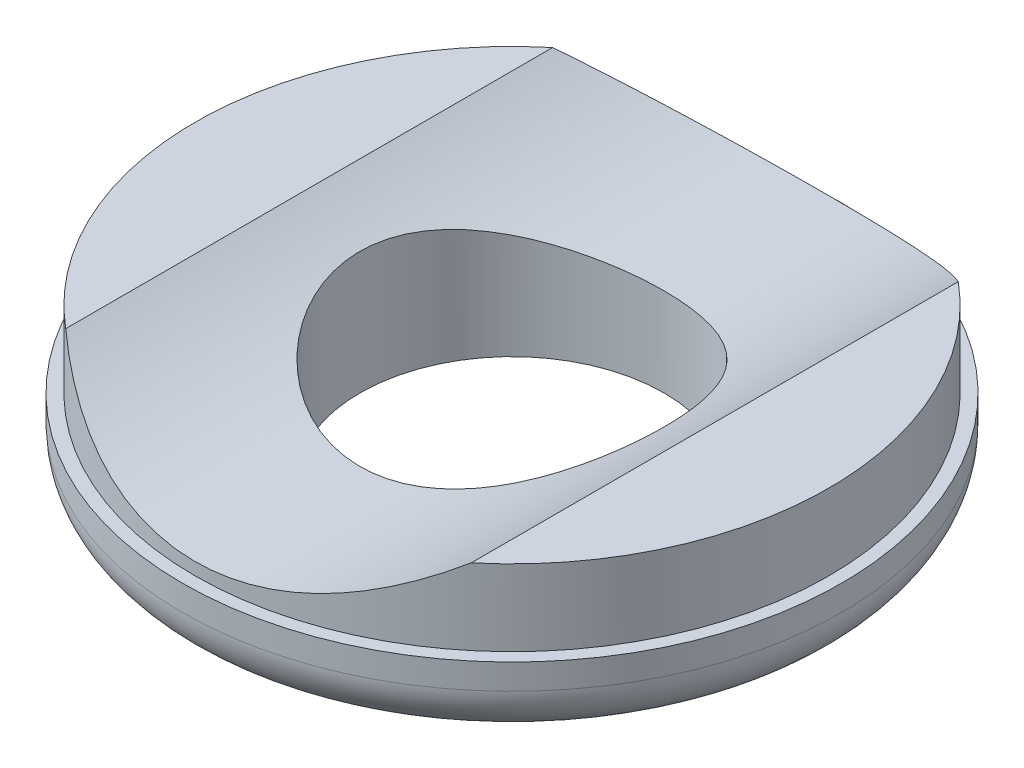
ISO-10303-21;
HEADER;
FILE_DESCRIPTION(('STEP AP214'),'2;1');
FILE_NAME('part.step','',(''),(''),'','','');
FILE_SCHEMA(('AUTOMOTIVE_DESIGN { 1 0 10303 214 1 1 1 1 }'));
ENDSEC;
DATA;
#1=APPLICATION_CONTEXT('core data for automotive mechanical design processes');
#2=APPLICATION_PROTOCOL_DEFINITION('international standard','automotive_design',2000,#1);
#3=PRODUCT_CONTEXT('',#1,'mechanical');
#4=PRODUCT('Part','Part','',(#3));
#5=PRODUCT_RELATED_PRODUCT_CATEGORY('part','',(#4));
#6=PRODUCT_DEFINITION_FORMATION('','',#4);
#7=PRODUCT_DEFINITION_CONTEXT('part definition',#1,'design');
#8=PRODUCT_DEFINITION('design','',#6,#7);
#9=PRODUCT_DEFINITION_SHAPE('','',#8);
#10=(LENGTH_UNIT() NAMED_UNIT(*) SI_UNIT(.MILLI.,.METRE.));
#11=(NAMED_UNIT(*) PLANE_ANGLE_UNIT() SI_UNIT($,.RADIAN.));
#12=(NAMED_UNIT(*) SI_UNIT($,.STERADIAN.) SOLID_ANGLE_UNIT());
#13=UNCERTAINTY_MEASURE_WITH_UNIT(LENGTH_MEASURE(1.E-05),#10,'distance_accuracy_value','');
#14=(GEOMETRIC_REPRESENTATION_CONTEXT(3) GLOBAL_UNCERTAINTY_ASSIGNED_CONTEXT((#13)) GLOBAL_UNIT_ASSIGNED_CONTEXT((#10,
#11,#12)) REPRESENTATION_CONTEXT('',''));
#15=CARTESIAN_POINT('',(0.,0.,0.));
#16=DIRECTION('',(0.,0.,1.));
#17=DIRECTION('',(1.,0.,0.));
#18=AXIS2_PLACEMENT_3D('',#15,#16,#17);
#19=CARTESIAN_POINT('',(0.,3.,0.));
#20=DIRECTION('',(0.,1.,0.));
#21=DIRECTION('',(0.,0.,1.));
#22=AXIS2_PLACEMENT_3D('',#19,#20,#21);
#23=PLANE('',#22);
#24=DIRECTION('',(0.,0.,1.));
#25=VECTOR('',#24,1.);
#26=CARTESIAN_POINT('',(-4.,3.,-6.5));
#27=LINE('',#26,#25);
#28=CARTESIAN_POINT('',(-4.,3.,-4.80234317807464));
#29=VERTEX_POINT('',#28);
#30=CARTESIAN_POINT('',(-4.,3.,4.80234317807464));
#31=VERTEX_POINT('',#30);
#32=EDGE_CURVE('E11',#29,#31,#27,.T.);
#33=ORIENTED_EDGE('',*,*,#32,.F.);
#34=CARTESIAN_POINT('',(0.,3.,0.));
#35=DIRECTION('',(0.,1.,0.));
#36=DIRECTION('',(0.,0.,1.));
#37=AXIS2_PLACEMENT_3D('',#34,#35,#36);
#38=CIRCLE('',#37,6.25);
#39=EDGE_CURVE('E79',#29,#31,#38,.T.);
#40=ORIENTED_EDGE('',*,*,#39,.T.);
#41=EDGE_LOOP('',(#33,#40));
#42=FACE_BOUND('',#41,.T.);
#43=ADVANCED_FACE('F37',(#42),#23,.T.);
#44=CARTESIAN_POINT('',(0.,1.5,0.));
#45=DIRECTION('',(0.,-1.,0.));
#46=DIRECTION('',(0.,0.,-1.));
#47=AXIS2_PLACEMENT_3D('',#44,#45,#46);
#48=CYLINDRICAL_SURFACE('',#47,6.5);
#49=CARTESIAN_POINT('',(0.,1.,0.));
#50=DIRECTION('',(0.,1.,0.));
#51=DIRECTION('',(0.,0.,1.));
#52=AXIS2_PLACEMENT_3D('',#49,#50,#51);
#53=CIRCLE('',#52,6.5);
#54=CARTESIAN_POINT('',(0.,1.,6.5));
#55=VERTEX_POINT('',#54);
#56=EDGE_CURVE('E85',#55,#55,#53,.T.);
#57=ORIENTED_EDGE('',*,*,#56,.T.);
#58=EDGE_LOOP('',(#57));
#59=FACE_BOUND('',#58,.T.);
#60=CARTESIAN_POINT('',(0.,1.5,0.));
#61=DIRECTION('',(0.,1.,0.));
#62=DIRECTION('',(0.,0.,1.));
#63=AXIS2_PLACEMENT_3D('',#60,#61,#62);
#64=CIRCLE('',#63,6.5);
#65=CARTESIAN_POINT('',(0.,1.5,6.5));
#66=VERTEX_POINT('',#65);
#67=EDGE_CURVE('E82',#66,#66,#64,.T.);
#68=ORIENTED_EDGE('',*,*,#67,.F.);
#69=EDGE_LOOP('',(#68));
#70=FACE_BOUND('',#69,.T.);
#71=ADVANCED_FACE('F108',(#59,#70),#48,.T.);
#72=CARTESIAN_POINT('',(0.,1.5,0.));
#73=DIRECTION('',(0.,1.,0.));
#74=DIRECTION('',(0.,0.,1.));
#75=AXIS2_PLACEMENT_3D('',#72,#73,#74);
#76=PLANE('',#75);
#77=CARTESIAN_POINT('',(0.,1.5,0.));
#78=DIRECTION('',(0.,1.,0.));
#79=DIRECTION('',(0.,0.,1.));
#80=AXIS2_PLACEMENT_3D('',#77,#78,#79);
#81=CIRCLE('',#80,6.25);
#82=CARTESIAN_POINT('',(0.,1.5,6.25));
#83=VERTEX_POINT('',#82);
#84=EDGE_CURVE('E71',#83,#83,#81,.T.);
#85=ORIENTED_EDGE('',*,*,#84,.F.);
#86=EDGE_LOOP('',(#85));
#87=FACE_BOUND('',#86,.T.);
#88=ORIENTED_EDGE('',*,*,#67,.T.);
#89=EDGE_LOOP('',(#88));
#90=FACE_BOUND('',#89,.T.);
#91=ADVANCED_FACE('F111',(#87,#90),#76,.T.);
#92=CARTESIAN_POINT('',(0.,0.,0.));
#93=DIRECTION('',(0.,1.,0.));
#94=DIRECTION('',(0.,0.,1.));
#95=AXIS2_PLACEMENT_3D('',#92,#93,#94);
#96=PLANE('',#95);
#97=CARTESIAN_POINT('',(0.,0.,0.));
#98=DIRECTION('',(0.,-1.,0.));
#99=DIRECTION('',(0.,0.,-1.));
#100=AXIS2_PLACEMENT_3D('',#97,#98,#99);
#101=CIRCLE('',#100,3.);
#102=CARTESIAN_POINT('',(0.,0.,-3.));
#103=VERTEX_POINT('',#102);
#104=EDGE_CURVE('E144',#103,#103,#101,.T.);
#105=ORIENTED_EDGE('',*,*,#104,.F.);
#106=EDGE_LOOP('',(#105));
#107=FACE_BOUND('',#106,.T.);
#108=CARTESIAN_POINT('',(0.,0.,0.));
#109=DIRECTION('',(0.,1.,0.));
#110=DIRECTION('',(0.,0.,1.));
#111=AXIS2_PLACEMENT_3D('',#108,#109,#110);
#112=CIRCLE('',#111,5.5);
#113=CARTESIAN_POINT('',(0.,0.,5.5));
#114=VERTEX_POINT('',#113);
#115=EDGE_CURVE('E95',#114,#114,#112,.F.);
#116=ORIENTED_EDGE('',*,*,#115,.T.);
#117=EDGE_LOOP('',(#116));
#118=FACE_BOUND('',#117,.T.);
#119=ADVANCED_FACE('F102',(#107,#118),#96,.F.);
#120=CARTESIAN_POINT('',(0.,1.,0.));
#121=DIRECTION('',(0.,1.,0.));
#122=DIRECTION('',(0.,0.,1.));
#123=AXIS2_PLACEMENT_3D('',#120,#121,#122);
#124=TOROIDAL_SURFACE('',#123,5.5,1.);
#125=ORIENTED_EDGE('',*,*,#115,.F.);
#126=EDGE_LOOP('',(#125));
#127=FACE_BOUND('',#126,.T.);
#128=ORIENTED_EDGE('',*,*,#56,.F.);
#129=EDGE_LOOP('',(#128));
#130=FACE_BOUND('',#129,.T.);
#131=ADVANCED_FACE('F39',(#127,#130),#124,.T.);
#132=CARTESIAN_POINT('',(0.,3.,0.));
#133=DIRECTION('',(0.,-1.,0.));
#134=DIRECTION('',(0.,0.,-1.));
#135=AXIS2_PLACEMENT_3D('',#132,#133,#134);
#136=CYLINDRICAL_SURFACE('',#135,6.25);
#137=CARTESIAN_POINT('',(4.,3.,4.80234317807464));
#138=VERTEX_POINT('',#137);
#139=CARTESIAN_POINT('',(4.,3.,-4.80234317807464));
#140=VERTEX_POINT('',#139);
#141=EDGE_CURVE('E77',#138,#140,#38,.T.);
#142=ORIENTED_EDGE('',*,*,#141,.F.);
#143=CARTESIAN_POINT('',(4.,3.,4.80234317807464));
#144=CARTESIAN_POINT('',(3.88808637940894,2.92206742611363,4.89555352241363));
#145=CARTESIAN_POINT('',(3.77204701833727,2.84613088944018,4.98558407702633));
#146=CARTESIAN_POINT('',(3.53169477447632,2.69915265086618,5.15864363601643));
#147=CARTESIAN_POINT('',(3.40737287303954,2.62811646190463,5.24166477750013));
#148=CARTESIAN_POINT('',(3.149393551674,2.49133558706504,5.4006477588114));
#149=CARTESIAN_POINT('',(3.01565495187687,2.42565117184933,5.47653037613661));
#150=CARTESIAN_POINT('',(2.74031543983346,2.3014678192108,5.61936097390056));
#151=CARTESIAN_POINT('',(2.59871613829657,2.24296741757003,5.68631077523283));
#152=CARTESIAN_POINT('',(2.30706761457639,2.13382448053344,5.8107882979779));
#153=CARTESIAN_POINT('',(2.15696256599863,2.08324474664861,5.86824089934368));
#154=CARTESIAN_POINT('',(1.85023041841806,1.99161931422127,5.97204644537537));
#155=CARTESIAN_POINT('',(1.6936074336664,1.95056770583599,6.0184062709168));
#156=CARTESIAN_POINT('',(1.37559338862179,1.87912836041785,6.09893695307819));
#157=CARTESIAN_POINT('',(1.21422486594992,1.84869698575257,6.13315769791626));
#158=CARTESIAN_POINT('',(0.887611058921652,1.79910301841444,6.1888667198876));
#159=CARTESIAN_POINT('',(0.72236665377538,1.77993789531309,6.21035785613129));
#160=CARTESIAN_POINT('',(0.413817597952062,1.75534700415871,6.23792167052118));
#161=CARTESIAN_POINT('',(0.27079441877479,1.74833562051878,6.24577408232568));
#162=CARTESIAN_POINT('',(-0.0156098371941182,1.74311555037979,6.25162087944924));
#163=CARTESIAN_POINT('',(-0.15899088133908,1.74490608828416,6.24961613334885));
#164=CARTESIAN_POINT('',(-0.444934894573422,1.75725121083097,6.23578628958286));
#165=CARTESIAN_POINT('',(-0.587497617457922,1.76780830678397,6.2239583779257));
#166=CARTESIAN_POINT('',(-0.870594661550486,1.79745376856723,6.19070903227517));
#167=CARTESIAN_POINT('',(-1.01112901172136,1.81654201245795,6.16928773540439));
#168=CARTESIAN_POINT('',(-1.27813970949524,1.86101667840222,6.11929936428144));
#169=CARTESIAN_POINT('',(-1.40485050419645,1.88578749102324,6.09142927983077));
#170=CARTESIAN_POINT('',(-1.65496656392128,1.94180349871026,6.0282868686749));
#171=CARTESIAN_POINT('',(-1.77837085626338,1.97305057580495,5.99301239018465));
#172=CARTESIAN_POINT('',(-2.14298601189055,2.07587969336139,5.87666269198655));
#173=CARTESIAN_POINT('',(-2.37839573560312,2.15651465323117,5.78510026279095));
#174=CARTESIAN_POINT('',(-2.86398858662891,2.35113316145883,5.56253465965092));
#175=CARTESIAN_POINT('',(-3.11110461720863,2.46830247240542,5.42767845489563));
#176=CARTESIAN_POINT('',(-3.46053784530374,2.65833153250888,5.20635424473216));
#177=CARTESIAN_POINT('',(-3.5732652428025,2.72390429149683,5.12958352864839));
#178=CARTESIAN_POINT('',(-3.79178793338827,2.8590884732918,4.9702180445333));
#179=CARTESIAN_POINT('',(-3.89758960252256,2.92869606690774,4.88762878296049));
#180=CARTESIAN_POINT('',(-4.,3.,4.80234317807464));
#181=B_SPLINE_CURVE_WITH_KNOTS('',3,(#143,#144,#145,#146,#147,#148,#149,#150,#151,#152,#153,
#154,#155,#156,#157,#158,#159,#160,#161,#162,#163,#164,#165,#166,#167,#168,#169,#170,#171,#172,
#173,#174,#175,#176,#177,#178,#179,#180),.UNSPECIFIED.,.F.,.F.,(4,2,2,2,2,2,2,2,2,2,2,2,2,2,2,2,
2,2,4),(0.,0.495551453924618,0.991651610604404,1.49273138768691,1.99370886651963,
2.49847674537849,3.00293069905342,3.50528679134066,4.00753001003075,4.43717143775292,
4.86677500755455,5.29650168614105,5.72622222264643,6.12204450854642,6.51798198369611,
7.31048033319664,8.22166009049389,8.67538716395057,9.12869046980904),.UNSPECIFIED.);
#182=EDGE_CURVE('E57',#138,#31,#181,.T.);
#183=ORIENTED_EDGE('',*,*,#182,.T.);
#184=ORIENTED_EDGE('',*,*,#39,.F.);
#185=CARTESIAN_POINT('',(-4.,3.,-4.80234317807464));
#186=CARTESIAN_POINT('',(-3.88808637940894,2.92206742611363,-4.89555352241363));
#187=CARTESIAN_POINT('',(-3.77204701833727,2.84613088944018,-4.98558407702633));
#188=CARTESIAN_POINT('',(-3.53169477447632,2.69915265086618,-5.15864363601643));
#189=CARTESIAN_POINT('',(-3.40737287303954,2.62811646190463,-5.24166477750013));
#190=CARTESIAN_POINT('',(-3.149393551674,2.49133558706504,-5.4006477588114));
#191=CARTESIAN_POINT('',(-3.01565495187687,2.42565117184933,-5.47653037613661));
#192=CARTESIAN_POINT('',(-2.74031543983346,2.3014678192108,-5.61936097390056));
#193=CARTESIAN_POINT('',(-2.59871613829657,2.24296741757003,-5.68631077523283));
#194=CARTESIAN_POINT('',(-2.30706761457639,2.13382448053344,-5.8107882979779));
#195=CARTESIAN_POINT('',(-2.15696256599863,2.08324474664861,-5.86824089934368));
#196=CARTESIAN_POINT('',(-1.85023041841806,1.99161931422127,-5.97204644537537));
#197=CARTESIAN_POINT('',(-1.6936074336664,1.95056770583599,-6.0184062709168));
#198=CARTESIAN_POINT('',(-1.37559338862179,1.87912836041785,-6.09893695307819));
#199=CARTESIAN_POINT('',(-1.21422486594992,1.84869698575257,-6.13315769791626));
#200=CARTESIAN_POINT('',(-0.887611058921652,1.79910301841444,-6.1888667198876));
#201=CARTESIAN_POINT('',(-0.72236665377538,1.77993789531309,-6.21035785613129));
#202=CARTESIAN_POINT('',(-0.413817597952062,1.75534700415871,-6.23792167052118));
#203=CARTESIAN_POINT('',(-0.27079441877479,1.74833562051878,-6.24577408232568));
#204=CARTESIAN_POINT('',(0.0156098371941182,1.74311555037979,-6.25162087944924));
#205=CARTESIAN_POINT('',(0.15899088133908,1.74490608828416,-6.24961613334885));
#206=CARTESIAN_POINT('',(0.444934894573422,1.75725121083097,-6.23578628958286));
#207=CARTESIAN_POINT('',(0.587497617457922,1.76780830678397,-6.2239583779257));
#208=CARTESIAN_POINT('',(0.870594661550486,1.79745376856723,-6.19070903227517));
#209=CARTESIAN_POINT('',(1.01112901172136,1.81654201245795,-6.16928773540439));
#210=CARTESIAN_POINT('',(1.27813970949524,1.86101667840222,-6.11929936428144));
#211=CARTESIAN_POINT('',(1.40485050419645,1.88578749102324,-6.09142927983077));
#212=CARTESIAN_POINT('',(1.65496656392128,1.94180349871026,-6.0282868686749));
#213=CARTESIAN_POINT('',(1.77837085626338,1.97305057580495,-5.99301239018465));
#214=CARTESIAN_POINT('',(2.14298601189055,2.07587969336139,-5.87666269198655));
#215=CARTESIAN_POINT('',(2.37839573560312,2.15651465323117,-5.78510026279095));
#216=CARTESIAN_POINT('',(2.86398858662891,2.35113316145883,-5.56253465965092));
#217=CARTESIAN_POINT('',(3.11110461720863,2.46830247240541,-5.42767845489563));
#218=CARTESIAN_POINT('',(3.46053784530374,2.65833153250888,-5.20635424473216));
#219=CARTESIAN_POINT('',(3.5732652428025,2.72390429149682,-5.1295835286484));
#220=CARTESIAN_POINT('',(3.79178793338827,2.8590884732918,-4.9702180445333));
#221=CARTESIAN_POINT('',(3.89758960252256,2.92869606690774,-4.88762878296049));
#222=CARTESIAN_POINT('',(4.,3.,-4.80234317807464));
#223=B_SPLINE_CURVE_WITH_KNOTS('',3,(#185,#186,#187,#188,#189,#190,#191,#192,#193,#194,#195,
#196,#197,#198,#199,#200,#201,#202,#203,#204,#205,#206,#207,#208,#209,#210,#211,#212,#213,#214,
#215,#216,#217,#218,#219,#220,#221,#222),.UNSPECIFIED.,.F.,.F.,(4,2,2,2,2,2,2,2,2,2,2,2,2,2,2,2,
2,2,4),(0.,0.495551453924618,0.991651610604404,1.49273138768691,1.99370886651963,
2.49847674537849,3.00293069905342,3.50528679134066,4.00753001003075,4.43717143775292,
4.86677500755455,5.29650168614105,5.72622222264643,6.12204450854642,6.51798198369611,
7.31048033319664,8.22166009049388,8.67538716395057,9.12869046980904),.UNSPECIFIED.);
#224=EDGE_CURVE('E67',#29,#140,#223,.T.);
#225=ORIENTED_EDGE('',*,*,#224,.T.);
#226=EDGE_LOOP('',(#142,#183,#184,#225));
#227=FACE_BOUND('',#226,.T.);
#228=ORIENTED_EDGE('',*,*,#84,.T.);
#229=EDGE_LOOP('',(#228));
#230=FACE_BOUND('',#229,.T.);
#231=ADVANCED_FACE('F75',(#227,#230),#136,.T.);
#232=DIRECTION('',(0.,0.,1.));
#233=VECTOR('',#232,1.);
#234=CARTESIAN_POINT('',(4.,3.,-6.5));
#235=LINE('',#234,#233);
#236=EDGE_CURVE('E51',#138,#140,#235,.F.);
#237=ORIENTED_EDGE('',*,*,#236,.F.);
#238=ORIENTED_EDGE('',*,*,#141,.T.);
#239=EDGE_LOOP('',(#237,#238));
#240=FACE_BOUND('',#239,.T.);
#241=ADVANCED_FACE('F81',(#240),#23,.T.);
#242=CARTESIAN_POINT('',(0.,8.74456264653803,-6.5));
#243=DIRECTION('',(0.,0.,1.));
#244=DIRECTION('',(1.,0.,0.));
#245=AXIS2_PLACEMENT_3D('',#242,#243,#244);
#246=CYLINDRICAL_SURFACE('',#245,7.);
#247=CARTESIAN_POINT('',(0.,1.74456264653803,-3.));
#248=CARTESIAN_POINT('',(0.160281740269091,1.74456856257513,-2.99999253041854));
#249=CARTESIAN_POINT('',(0.32083390752243,1.75013014602538,-2.98707868390345));
#250=CARTESIAN_POINT('',(0.637349314958984,1.77182344025084,-2.93591763457354));
#251=CARTESIAN_POINT('',(0.793299928144206,1.78798183703078,-2.89760647092665));
#252=CARTESIAN_POINT('',(1.0955347051483,1.82914633914457,-2.79733023637488));
#253=CARTESIAN_POINT('',(1.24185033642246,1.85412175424862,-2.7354471561946));
#254=CARTESIAN_POINT('',(1.5218733278968,1.91050604377155,-2.59013558143627));
#255=CARTESIAN_POINT('',(1.65558409053381,1.94191317477156,-2.5067129239082));
#256=CARTESIAN_POINT('',(1.91384144205639,2.00988442778253,-2.3160723523121));
#257=CARTESIAN_POINT('',(2.03764045493602,2.04662368691432,-2.20790474010422));
#258=CARTESIAN_POINT('',(2.26599040232609,2.12038610315032,-1.97285613149922));
#259=CARTESIAN_POINT('',(2.3705306503261,2.15740940607093,-1.84596481539728));
#260=CARTESIAN_POINT('',(2.56285686126492,2.2297420938258,-1.5689672772845));
#261=CARTESIAN_POINT('',(2.64946811752636,2.26485804408878,-1.41798954197069));
#262=CARTESIAN_POINT('',(2.79573199408101,2.32660096018776,-1.10189057181104));
#263=CARTESIAN_POINT('',(2.8553992914263,2.35323254533669,-0.936777095513754));
#264=CARTESIAN_POINT('',(2.94294919918374,2.39308465566527,-0.605699261690754));
#265=CARTESIAN_POINT('',(2.97227494401776,2.40691043218263,-0.440192298220545));
#266=CARTESIAN_POINT('',(3.00280607158394,2.42131414965672,-0.10607403038965));
#267=CARTESIAN_POINT('',(3.00402828615096,2.42190002028654,0.0625353552913809));
#268=CARTESIAN_POINT('',(2.97939999510613,2.41026690751263,0.383299903718551));
#269=CARTESIAN_POINT('',(2.95576113815072,2.39909393723645,0.535670623331995));
#270=CARTESIAN_POINT('',(2.88580772808799,2.36697853136227,0.834027585901331));
#271=CARTESIAN_POINT('',(2.83948852833539,2.34603409387211,0.980012513886144));
#272=CARTESIAN_POINT('',(2.7245765907069,2.29625578998337,1.26524715143523));
#273=CARTESIAN_POINT('',(2.65551974428426,2.26725969542411,1.40428029421815));
#274=CARTESIAN_POINT('',(2.49742304873013,2.20467770771674,1.66934632406943));
#275=CARTESIAN_POINT('',(2.40837507480489,2.17108995060175,1.79537389492949));
#276=CARTESIAN_POINT('',(2.20343405392229,2.0994386011859,2.04277750362138));
#277=CARTESIAN_POINT('',(2.08584728856133,2.06124409264594,2.16271672947197));
#278=CARTESIAN_POINT('',(1.83187332405076,1.9872165889528,2.38167159065595));
#279=CARTESIAN_POINT('',(1.69548121627989,1.95138421399151,2.48068174587821));
#280=CARTESIAN_POINT('',(1.40318582301271,1.88496570964233,2.65724393280697));
#281=CARTESIAN_POINT('',(1.24687114970231,1.85453809620076,2.73417901870558));
#282=CARTESIAN_POINT('',(0.921879694158933,1.80358868393245,2.86015023761472));
#283=CARTESIAN_POINT('',(0.753210215657663,1.78306108613822,2.9092027059777));
#284=CARTESIAN_POINT('',(0.420276238941368,1.75532737760418,2.97493386045897));
#285=CARTESIAN_POINT('',(0.256457961010923,1.74733014689214,2.99353876531439));
#286=CARTESIAN_POINT('',(-0.072143301118509,1.74300848002064,3.00362957640823));
#287=CARTESIAN_POINT('',(-0.236925971900558,1.74668044122137,2.99512385253237));
#288=CARTESIAN_POINT('',(-0.553542439626674,1.76477588333653,2.95258436794519));
#289=CARTESIAN_POINT('',(-0.70559893150422,1.77861745180159,2.91993167855167));
#290=CARTESIAN_POINT('',(-1.00189113639242,1.81502376643829,2.83197910576183));
#291=CARTESIAN_POINT('',(-1.14612587370002,1.83758959805282,2.77667640427784));
#292=CARTESIAN_POINT('',(-1.42777696523888,1.89017513140083,2.64319884049788));
#293=CARTESIAN_POINT('',(-1.56483974951837,1.92040559265329,2.56436366977394));
#294=CARTESIAN_POINT('',(-1.82428490564705,1.98513276262365,2.38678105552406));
#295=CARTESIAN_POINT('',(-1.94666097512992,2.01963129005045,2.28802511197671));
#296=CARTESIAN_POINT('',(-2.18296759532595,2.092414759559,2.0647104121571));
#297=CARTESIAN_POINT('',(-2.29556617553686,2.13078909655212,1.93876778993861));
#298=CARTESIAN_POINT('',(-2.49843431443676,2.2047222696355,1.66921770136839));
#299=CARTESIAN_POINT('',(-2.58869766421195,2.24028032097011,1.52560533962517));
#300=CARTESIAN_POINT('',(-2.74563875632303,2.30493295368483,1.22118614704143));
#301=CARTESIAN_POINT('',(-2.81186415020233,2.3339000866636,1.06011699095001));
#302=CARTESIAN_POINT('',(-2.91565885028324,2.38042657123657,0.727473673260499));
#303=CARTESIAN_POINT('',(-2.95325364225748,2.39799606646503,0.555909001675423));
#304=CARTESIAN_POINT('',(-2.9961194841997,2.41812783517182,0.222008827667048));
#305=CARTESIAN_POINT('',(-3.00374693238451,2.42178338988343,0.0600407324894115));
#306=CARTESIAN_POINT('',(-2.99282649265778,2.41660646382417,-0.262789746911497));
#307=CARTESIAN_POINT('',(-2.97428322126543,2.40777618555577,-0.42365232111928));
#308=CARTESIAN_POINT('',(-2.91356431394149,2.37964610763032,-0.73104169627336));
#309=CARTESIAN_POINT('',(-2.87266975661121,2.36091551554406,-0.877878791570755));
#310=CARTESIAN_POINT('',(-2.769702223632,2.3155738882183,-1.16262076608389));
#311=CARTESIAN_POINT('',(-2.70762322652258,2.28896061269087,-1.30052309240774));
#312=CARTESIAN_POINT('',(-2.55963250501149,2.22881017327843,-1.57282070867956));
#313=CARTESIAN_POINT('',(-2.47248232196069,2.19494615076793,-1.70646915369476));
#314=CARTESIAN_POINT('',(-2.2784960092513,2.12496485727236,-1.95798236124754));
#315=CARTESIAN_POINT('',(-2.17165243666714,2.08884673779823,-2.07584112704921));
#316=CARTESIAN_POINT('',(-1.93135048700133,2.01500840011969,-2.30200363550072));
#317=CARTESIAN_POINT('',(-1.79645724733279,1.97738665205067,-2.40881956557276));
#318=CARTESIAN_POINT('',(-1.50919760355001,1.90759787644714,-2.59843976003117));
#319=CARTESIAN_POINT('',(-1.35682332068822,1.8754333248013,-2.68123313759985));
#320=CARTESIAN_POINT('',(-1.11954532843042,1.83420822567015,-2.78459269098953));
#321=CARTESIAN_POINT('',(-1.03957288024831,1.82169866688351,-2.81543329080184));
#322=CARTESIAN_POINT('',(-0.876970802782692,1.79923062490562,-2.87023820202229));
#323=CARTESIAN_POINT('',(-0.794342461515162,1.78927092551981,-2.89420579227536));
#324=CARTESIAN_POINT('',(-0.627265567421394,1.77221886574651,-2.93494771728342));
#325=CARTESIAN_POINT('',(-0.542821986677283,1.76511951915684,-2.95173958438048));
#326=CARTESIAN_POINT('',(-0.372647906839313,1.75396945018519,-2.97800871420341));
#327=CARTESIAN_POINT('',(-0.286918376030203,1.74991654094418,-2.9874912240139));
#328=CARTESIAN_POINT('',(-0.167492669563775,1.74648672089567,-2.99550827494356));
#329=CARTESIAN_POINT('',(-0.134021137958666,1.7457658763827,-2.99719185411763));
#330=CARTESIAN_POINT('',(-0.0670370145842119,1.74480321902242,-2.99943850128407));
#331=CARTESIAN_POINT('',(-0.0335244225617063,1.74456140914363,-3.00000156233271));
#332=CARTESIAN_POINT('',(0.,1.74456264653803,-3.));
#333=B_SPLINE_CURVE_WITH_KNOTS('',3,(#247,#248,#249,#250,#251,#252,#253,#254,#255,#256,#257,
#258,#259,#260,#261,#262,#263,#264,#265,#266,#267,#268,#269,#270,#271,#272,#273,#274,#275,#276,
#277,#278,#279,#280,#281,#282,#283,#284,#285,#286,#287,#288,#289,#290,#291,#292,#293,#294,#295,
#296,#297,#298,#299,#300,#301,#302,#303,#304,#305,#306,#307,#308,#309,#310,#311,#312,#313,#314,
#315,#316,#317,#318,#319,#320,#321,#322,#323,#324,#325,#326,#327,#328,#329,#330,#331,#332),
.UNSPECIFIED.,.T.,.F.,(4,2,2,2,2,2,2,2,2,2,2,2,2,2,2,2,2,2,2,2,2,2,2,2,2,2,2,2,2,2,2,2,2,2,2,2,
2,2,2,2,2,2,4),(0.,0.480714322748849,0.962643903423346,1.44291226275142,1.92305060961531,
2.42622743558506,2.92968263421744,3.45969560860062,3.98941952228263,4.492594268281,
4.99546764377915,5.45710720323576,5.91884138089948,6.3906540887232,6.86265889892285,
7.37709837725841,7.89167239108963,8.41947244601234,8.94696296364742,9.43957347502028,
9.93203191709568,10.3983119423363,10.8646499992176,11.3455505516221,11.8266567358409,
12.3440285038672,12.8615439335848,13.3883469079738,13.9146803943342,14.3986848887267,
14.882604015318,15.341320451094,15.8001673810816,16.2874475008663,16.7749121624767,
17.3008416934143,17.8270092002163,18.0865840789243,18.3460349177801,18.6048481685098,
18.8634754544625,18.964020720529,19.0645666096629),.UNSPECIFIED.);
#334=CARTESIAN_POINT('',(0.,1.74456264653803,-3.));
#335=VERTEX_POINT('',#334);
#336=EDGE_CURVE('E41',#335,#335,#333,.T.);
#337=ORIENTED_EDGE('',*,*,#336,.T.);
#338=EDGE_LOOP('',(#337));
#339=FACE_BOUND('',#338,.T.);
#340=ORIENTED_EDGE('',*,*,#236,.T.);
#341=ORIENTED_EDGE('',*,*,#224,.F.);
#342=ORIENTED_EDGE('',*,*,#32,.T.);
#343=ORIENTED_EDGE('',*,*,#182,.F.);
#344=EDGE_LOOP('',(#340,#341,#342,#343));
#345=FACE_BOUND('',#344,.T.);
#346=ADVANCED_FACE('F66',(#339,#345),#246,.F.);
#347=CARTESIAN_POINT('',(0.,3.,0.));
#348=DIRECTION('',(0.,-1.,0.));
#349=DIRECTION('',(0.,0.,-1.));
#350=AXIS2_PLACEMENT_3D('',#347,#348,#349);
#351=CYLINDRICAL_SURFACE('',#350,3.);
#352=ORIENTED_EDGE('',*,*,#104,.T.);
#353=EDGE_LOOP('',(#352));
#354=FACE_BOUND('',#353,.T.);
#355=ORIENTED_EDGE('',*,*,#336,.F.);
#356=EDGE_LOOP('',(#355));
#357=FACE_BOUND('',#356,.T.);
#358=ADVANCED_FACE('F133',(#354,#357),#351,.F.);
#359=CLOSED_SHELL('',(#43,#71,#91,#119,#131,#231,#241,#346,#358));
#360=MANIFOLD_SOLID_BREP('B2',#359);
#361=ADVANCED_BREP_SHAPE_REPRESENTATION('',(#18,#360),#14);
#362=SHAPE_DEFINITION_REPRESENTATION(#9,#361);
ENDSEC;
END-ISO-10303-21;
